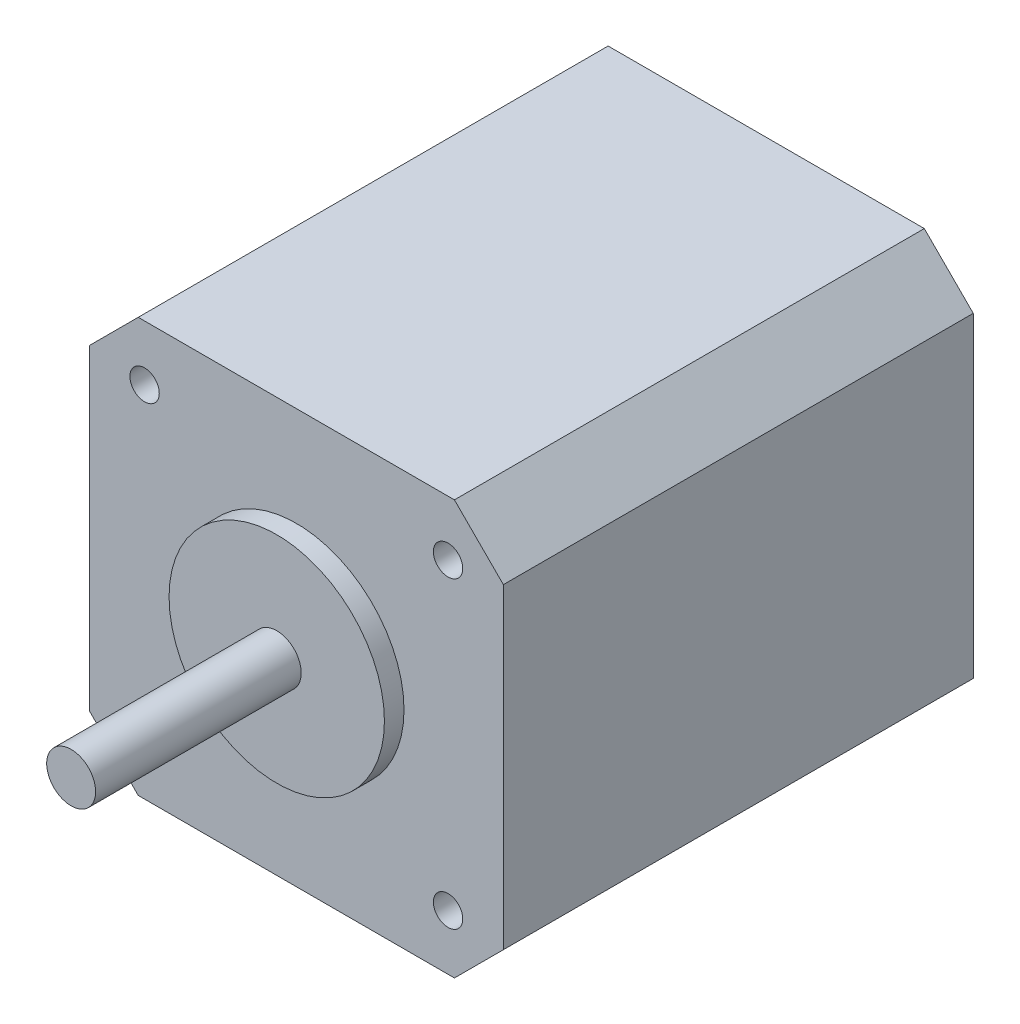
ISO-10303-21;
HEADER;
FILE_DESCRIPTION(('STEP AP214'),'2;1');
FILE_NAME('part.step','',(''),(''),'','','');
FILE_SCHEMA(('AUTOMOTIVE_DESIGN { 1 0 10303 214 1 1 1 1 }'));
ENDSEC;
DATA;
#1=APPLICATION_CONTEXT('core data for automotive mechanical design processes');
#2=APPLICATION_PROTOCOL_DEFINITION('international standard','automotive_design',2000,#1);
#3=PRODUCT_CONTEXT('',#1,'mechanical');
#4=PRODUCT('Part','Part','',(#3));
#5=PRODUCT_RELATED_PRODUCT_CATEGORY('part','',(#4));
#6=PRODUCT_DEFINITION_FORMATION('','',#4);
#7=PRODUCT_DEFINITION_CONTEXT('part definition',#1,'design');
#8=PRODUCT_DEFINITION('design','',#6,#7);
#9=PRODUCT_DEFINITION_SHAPE('','',#8);
#10=(LENGTH_UNIT() NAMED_UNIT(*) SI_UNIT(.MILLI.,.METRE.));
#11=(NAMED_UNIT(*) PLANE_ANGLE_UNIT() SI_UNIT($,.RADIAN.));
#12=(NAMED_UNIT(*) SI_UNIT($,.STERADIAN.) SOLID_ANGLE_UNIT());
#13=UNCERTAINTY_MEASURE_WITH_UNIT(LENGTH_MEASURE(1.E-05),#10,'distance_accuracy_value','');
#14=(GEOMETRIC_REPRESENTATION_CONTEXT(3) GLOBAL_UNCERTAINTY_ASSIGNED_CONTEXT((#13)) GLOBAL_UNIT_ASSIGNED_CONTEXT((#10,
#11,#12)) REPRESENTATION_CONTEXT('',''));
#15=CARTESIAN_POINT('',(0.,0.,0.));
#16=DIRECTION('',(0.,0.,1.));
#17=DIRECTION('',(1.,0.,0.));
#18=AXIS2_PLACEMENT_3D('',#15,#16,#17);
#19=CARTESIAN_POINT('',(21.15,21.15,-48.));
#20=DIRECTION('',(1.,0.,0.));
#21=DIRECTION('',(0.,0.,-1.));
#22=AXIS2_PLACEMENT_3D('',#19,#20,#21);
#23=PLANE('',#22);
#24=DIRECTION('',(0.,1.,0.));
#25=VECTOR('',#24,1.);
#26=CARTESIAN_POINT('',(21.15,21.15,0.));
#27=LINE('',#26,#25);
#28=CARTESIAN_POINT('',(21.15,-16.15,0.));
#29=VERTEX_POINT('',#28);
#30=CARTESIAN_POINT('',(21.15,16.15,0.));
#31=VERTEX_POINT('',#30);
#32=EDGE_CURVE('E210',#29,#31,#27,.T.);
#33=ORIENTED_EDGE('',*,*,#32,.F.);
#34=DIRECTION('',(0.,0.,-1.));
#35=VECTOR('',#34,1.);
#36=CARTESIAN_POINT('',(21.15,-16.15,-48.));
#37=LINE('',#36,#35);
#38=CARTESIAN_POINT('',(21.15,-16.15,-48.));
#39=VERTEX_POINT('',#38);
#40=EDGE_CURVE('E285',#29,#39,#37,.T.);
#41=ORIENTED_EDGE('',*,*,#40,.T.);
#42=DIRECTION('',(0.,1.,0.));
#43=VECTOR('',#42,1.);
#44=CARTESIAN_POINT('',(21.15,21.15,-48.));
#45=LINE('',#44,#43);
#46=CARTESIAN_POINT('',(21.15,16.15,-48.));
#47=VERTEX_POINT('',#46);
#48=EDGE_CURVE('E214',#39,#47,#45,.T.);
#49=ORIENTED_EDGE('',*,*,#48,.T.);
#50=DIRECTION('',(0.,0.,1.));
#51=VECTOR('',#50,1.);
#52=CARTESIAN_POINT('',(21.15,16.15,-48.));
#53=LINE('',#52,#51);
#54=EDGE_CURVE('E281',#47,#31,#53,.T.);
#55=ORIENTED_EDGE('',*,*,#54,.T.);
#56=EDGE_LOOP('',(#33,#41,#49,#55));
#57=FACE_BOUND('',#56,.T.);
#58=ADVANCED_FACE('F41',(#57),#23,.T.);
#59=CARTESIAN_POINT('',(-21.15,-21.15,-48.));
#60=DIRECTION('',(0.,-1.,0.));
#61=DIRECTION('',(0.,0.,-1.));
#62=AXIS2_PLACEMENT_3D('',#59,#60,#61);
#63=PLANE('',#62);
#64=DIRECTION('',(0.,0.,-1.));
#65=VECTOR('',#64,1.);
#66=CARTESIAN_POINT('',(-8.,-21.15,-38.4));
#67=LINE('',#66,#65);
#68=CARTESIAN_POINT('',(-8.,-21.15,-38.4));
#69=VERTEX_POINT('',#68);
#70=CARTESIAN_POINT('',(-8.,-21.15,-48.));
#71=VERTEX_POINT('',#70);
#72=EDGE_CURVE('E152',#69,#71,#67,.T.);
#73=ORIENTED_EDGE('',*,*,#72,.F.);
#74=DIRECTION('',(1.,0.,0.));
#75=VECTOR('',#74,1.);
#76=CARTESIAN_POINT('',(8.,-21.15,-38.4));
#77=LINE('',#76,#75);
#78=CARTESIAN_POINT('',(8.,-21.15,-38.4));
#79=VERTEX_POINT('',#78);
#80=EDGE_CURVE('E137',#69,#79,#77,.T.);
#81=ORIENTED_EDGE('',*,*,#80,.T.);
#82=DIRECTION('',(0.,0.,-1.));
#83=VECTOR('',#82,1.);
#84=CARTESIAN_POINT('',(8.,-21.15,-38.4));
#85=LINE('',#84,#83);
#86=CARTESIAN_POINT('',(7.99999999999999,-21.15,-48.));
#87=VERTEX_POINT('',#86);
#88=EDGE_CURVE('E163',#79,#87,#85,.T.);
#89=ORIENTED_EDGE('',*,*,#88,.T.);
#90=DIRECTION('',(1.,0.,0.));
#91=VECTOR('',#90,1.);
#92=CARTESIAN_POINT('',(-21.15,-21.15,-48.));
#93=LINE('',#92,#91);
#94=CARTESIAN_POINT('',(16.15,-21.15,-48.));
#95=VERTEX_POINT('',#94);
#96=EDGE_CURVE('E226',#87,#95,#93,.T.);
#97=ORIENTED_EDGE('',*,*,#96,.T.);
#98=DIRECTION('',(0.,0.,1.));
#99=VECTOR('',#98,1.);
#100=CARTESIAN_POINT('',(16.15,-21.15,-48.));
#101=LINE('',#100,#99);
#102=CARTESIAN_POINT('',(16.15,-21.15,0.));
#103=VERTEX_POINT('',#102);
#104=EDGE_CURVE('E262',#95,#103,#101,.T.);
#105=ORIENTED_EDGE('',*,*,#104,.T.);
#106=DIRECTION('',(1.,0.,0.));
#107=VECTOR('',#106,1.);
#108=CARTESIAN_POINT('',(-21.15,-21.15,0.));
#109=LINE('',#108,#107);
#110=CARTESIAN_POINT('',(-16.15,-21.15,0.));
#111=VERTEX_POINT('',#110);
#112=EDGE_CURVE('E219',#111,#103,#109,.T.);
#113=ORIENTED_EDGE('',*,*,#112,.F.);
#114=DIRECTION('',(0.,0.,-1.));
#115=VECTOR('',#114,1.);
#116=CARTESIAN_POINT('',(-16.15,-21.15,-48.));
#117=LINE('',#116,#115);
#118=CARTESIAN_POINT('',(-16.15,-21.15,-48.));
#119=VERTEX_POINT('',#118);
#120=EDGE_CURVE('E266',#111,#119,#117,.T.);
#121=ORIENTED_EDGE('',*,*,#120,.T.);
#122=EDGE_CURVE('E161',#119,#71,#93,.T.);
#123=ORIENTED_EDGE('',*,*,#122,.T.);
#124=EDGE_LOOP('',(#73,#81,#89,#97,#105,#113,#121,#123));
#125=FACE_BOUND('',#124,.T.);
#126=ADVANCED_FACE('F159',(#125),#63,.T.);
#127=CARTESIAN_POINT('',(-21.15,21.15,-48.));
#128=DIRECTION('',(-1.,0.,0.));
#129=DIRECTION('',(0.,-1.,0.));
#130=AXIS2_PLACEMENT_3D('',#127,#128,#129);
#131=PLANE('',#130);
#132=DIRECTION('',(0.,-1.,0.));
#133=VECTOR('',#132,1.);
#134=CARTESIAN_POINT('',(-21.15,21.15,-48.));
#135=LINE('',#134,#133);
#136=CARTESIAN_POINT('',(-21.15,16.15,-48.));
#137=VERTEX_POINT('',#136);
#138=CARTESIAN_POINT('',(-21.15,-16.15,-48.));
#139=VERTEX_POINT('',#138);
#140=EDGE_CURVE('E222',#137,#139,#135,.T.);
#141=ORIENTED_EDGE('',*,*,#140,.T.);
#142=DIRECTION('',(0.,0.,1.));
#143=VECTOR('',#142,1.);
#144=CARTESIAN_POINT('',(-21.15,-16.15,-48.));
#145=LINE('',#144,#143);
#146=CARTESIAN_POINT('',(-21.15,-16.15,0.));
#147=VERTEX_POINT('',#146);
#148=EDGE_CURVE('E246',#139,#147,#145,.T.);
#149=ORIENTED_EDGE('',*,*,#148,.T.);
#150=DIRECTION('',(0.,-1.,0.));
#151=VECTOR('',#150,1.);
#152=CARTESIAN_POINT('',(-21.15,21.15,0.));
#153=LINE('',#152,#151);
#154=CARTESIAN_POINT('',(-21.15,16.15,0.));
#155=VERTEX_POINT('',#154);
#156=EDGE_CURVE('E237',#155,#147,#153,.T.);
#157=ORIENTED_EDGE('',*,*,#156,.F.);
#158=DIRECTION('',(0.,0.,-1.));
#159=VECTOR('',#158,1.);
#160=CARTESIAN_POINT('',(-21.15,16.15,-48.));
#161=LINE('',#160,#159);
#162=EDGE_CURVE('E229',#155,#137,#161,.T.);
#163=ORIENTED_EDGE('',*,*,#162,.T.);
#164=EDGE_LOOP('',(#141,#149,#157,#163));
#165=FACE_BOUND('',#164,.T.);
#166=ADVANCED_FACE('F341',(#165),#131,.T.);
#167=CARTESIAN_POINT('',(-21.15,21.15,-48.));
#168=DIRECTION('',(0.,1.,0.));
#169=DIRECTION('',(0.,0.,1.));
#170=AXIS2_PLACEMENT_3D('',#167,#168,#169);
#171=PLANE('',#170);
#172=DIRECTION('',(-1.,0.,0.));
#173=VECTOR('',#172,1.);
#174=CARTESIAN_POINT('',(-21.15,21.15,0.));
#175=LINE('',#174,#173);
#176=CARTESIAN_POINT('',(16.15,21.15,0.));
#177=VERTEX_POINT('',#176);
#178=CARTESIAN_POINT('',(-16.15,21.15,0.));
#179=VERTEX_POINT('',#178);
#180=EDGE_CURVE('E233',#177,#179,#175,.T.);
#181=ORIENTED_EDGE('',*,*,#180,.F.);
#182=DIRECTION('',(0.,0.,-1.));
#183=VECTOR('',#182,1.);
#184=CARTESIAN_POINT('',(16.15,21.15,-48.));
#185=LINE('',#184,#183);
#186=CARTESIAN_POINT('',(16.15,21.15,-48.));
#187=VERTEX_POINT('',#186);
#188=EDGE_CURVE('E52',#177,#187,#185,.T.);
#189=ORIENTED_EDGE('',*,*,#188,.T.);
#190=DIRECTION('',(-1.,0.,0.));
#191=VECTOR('',#190,1.);
#192=CARTESIAN_POINT('',(-21.15,21.15,-48.));
#193=LINE('',#192,#191);
#194=CARTESIAN_POINT('',(-16.15,21.15,-48.));
#195=VERTEX_POINT('',#194);
#196=EDGE_CURVE('E218',#187,#195,#193,.T.);
#197=ORIENTED_EDGE('',*,*,#196,.T.);
#198=DIRECTION('',(0.,0.,1.));
#199=VECTOR('',#198,1.);
#200=CARTESIAN_POINT('',(-16.15,21.15,-48.));
#201=LINE('',#200,#199);
#202=EDGE_CURVE('E288',#195,#179,#201,.T.);
#203=ORIENTED_EDGE('',*,*,#202,.T.);
#204=EDGE_LOOP('',(#181,#189,#197,#203));
#205=FACE_BOUND('',#204,.T.);
#206=ADVANCED_FACE('F295',(#205),#171,.T.);
#207=CARTESIAN_POINT('',(0.,0.,-48.));
#208=DIRECTION('',(0.,0.,1.));
#209=DIRECTION('',(1.,0.,0.));
#210=AXIS2_PLACEMENT_3D('',#207,#208,#209);
#211=PLANE('',#210);
#212=ORIENTED_EDGE('',*,*,#122,.F.);
#213=DIRECTION('',(0.707106781186549,-0.707106781186546,0.));
#214=VECTOR('',#213,1.);
#215=CARTESIAN_POINT('',(-21.15,-16.15,-48.));
#216=LINE('',#215,#214);
#217=EDGE_CURVE('E278',#119,#139,#216,.F.);
#218=ORIENTED_EDGE('',*,*,#217,.T.);
#219=ORIENTED_EDGE('',*,*,#140,.F.);
#220=DIRECTION('',(-0.707106781186546,-0.707106781186549,0.));
#221=VECTOR('',#220,1.);
#222=CARTESIAN_POINT('',(-16.15,21.15,-48.));
#223=LINE('',#222,#221);
#224=EDGE_CURVE('E68',#137,#195,#223,.F.);
#225=ORIENTED_EDGE('',*,*,#224,.T.);
#226=ORIENTED_EDGE('',*,*,#196,.F.);
#227=DIRECTION('',(-0.707106781186549,0.707106781186546,0.));
#228=VECTOR('',#227,1.);
#229=CARTESIAN_POINT('',(21.15,16.15,-48.));
#230=LINE('',#229,#228);
#231=EDGE_CURVE('E271',#187,#47,#230,.F.);
#232=ORIENTED_EDGE('',*,*,#231,.T.);
#233=ORIENTED_EDGE('',*,*,#48,.F.);
#234=DIRECTION('',(0.707106781186546,0.707106781186549,0.));
#235=VECTOR('',#234,1.);
#236=CARTESIAN_POINT('',(16.15,-21.15,-48.));
#237=LINE('',#236,#235);
#238=EDGE_CURVE('E274',#39,#95,#237,.F.);
#239=ORIENTED_EDGE('',*,*,#238,.T.);
#240=ORIENTED_EDGE('',*,*,#96,.F.);
#241=DIRECTION('',(0.,-1.,0.));
#242=VECTOR('',#241,1.);
#243=CARTESIAN_POINT('',(8.,-28.15,-48.));
#244=LINE('',#243,#242);
#245=CARTESIAN_POINT('',(8.,-28.15,-48.));
#246=VERTEX_POINT('',#245);
#247=EDGE_CURVE('E60',#87,#246,#244,.T.);
#248=ORIENTED_EDGE('',*,*,#247,.T.);
#249=DIRECTION('',(-1.,0.,0.));
#250=VECTOR('',#249,1.);
#251=CARTESIAN_POINT('',(8.,-28.15,-48.));
#252=LINE('',#251,#250);
#253=CARTESIAN_POINT('',(-8.,-28.15,-48.));
#254=VERTEX_POINT('',#253);
#255=EDGE_CURVE('E156',#246,#254,#252,.T.);
#256=ORIENTED_EDGE('',*,*,#255,.T.);
#257=DIRECTION('',(0.,1.,0.));
#258=VECTOR('',#257,1.);
#259=CARTESIAN_POINT('',(-8.,-28.15,-48.));
#260=LINE('',#259,#258);
#261=EDGE_CURVE('E327',#254,#71,#260,.T.);
#262=ORIENTED_EDGE('',*,*,#261,.T.);
#263=EDGE_LOOP('',(#212,#218,#219,#225,#226,#232,#233,#239,#240,#248,#256,#262));
#264=FACE_BOUND('',#263,.T.);
#265=ADVANCED_FACE('F299',(#264),#211,.F.);
#266=CARTESIAN_POINT('',(0.,0.,0.));
#267=DIRECTION('',(0.,0.,1.));
#268=DIRECTION('',(1.,0.,0.));
#269=AXIS2_PLACEMENT_3D('',#266,#267,#268);
#270=PLANE('',#269);
#271=CARTESIAN_POINT('',(0.,0.,0.));
#272=DIRECTION('',(0.,0.,1.));
#273=DIRECTION('',(1.,0.,0.));
#274=AXIS2_PLACEMENT_3D('',#271,#272,#273);
#275=CIRCLE('',#274,11.);
#276=CARTESIAN_POINT('',(11.,0.,0.));
#277=VERTEX_POINT('',#276);
#278=EDGE_CURVE('E11',#277,#277,#275,.T.);
#279=ORIENTED_EDGE('',*,*,#278,.F.);
#280=EDGE_LOOP('',(#279));
#281=FACE_BOUND('',#280,.T.);
#282=CARTESIAN_POINT('',(15.5000000000002,15.4999999999998,0.));
#283=DIRECTION('',(0.,0.,1.));
#284=DIRECTION('',(1.,0.,0.));
#285=AXIS2_PLACEMENT_3D('',#282,#283,#284);
#286=CIRCLE('',#285,1.5);
#287=CARTESIAN_POINT('',(17.0000000000002,15.4999999999998,0.));
#288=VERTEX_POINT('',#287);
#289=EDGE_CURVE('E180',#288,#288,#286,.T.);
#290=ORIENTED_EDGE('',*,*,#289,.F.);
#291=EDGE_LOOP('',(#290));
#292=FACE_BOUND('',#291,.T.);
#293=CARTESIAN_POINT('',(-15.4999999999999,15.5000000000001,0.));
#294=DIRECTION('',(0.,0.,1.));
#295=DIRECTION('',(1.,0.,0.));
#296=AXIS2_PLACEMENT_3D('',#293,#294,#295);
#297=CIRCLE('',#296,1.5);
#298=CARTESIAN_POINT('',(-13.9999999999999,15.5000000000001,0.));
#299=VERTEX_POINT('',#298);
#300=EDGE_CURVE('E195',#299,#299,#297,.T.);
#301=ORIENTED_EDGE('',*,*,#300,.F.);
#302=EDGE_LOOP('',(#301));
#303=FACE_BOUND('',#302,.T.);
#304=CARTESIAN_POINT('',(-15.5000000000001,-15.4999999999999,0.));
#305=DIRECTION('',(0.,0.,1.));
#306=DIRECTION('',(1.,0.,0.));
#307=AXIS2_PLACEMENT_3D('',#304,#305,#306);
#308=CIRCLE('',#307,1.5);
#309=CARTESIAN_POINT('',(-14.0000000000001,-15.4999999999999,0.));
#310=VERTEX_POINT('',#309);
#311=EDGE_CURVE('E187',#310,#310,#308,.T.);
#312=ORIENTED_EDGE('',*,*,#311,.F.);
#313=EDGE_LOOP('',(#312));
#314=FACE_BOUND('',#313,.T.);
#315=CARTESIAN_POINT('',(15.5,-15.5,0.));
#316=DIRECTION('',(0.,0.,1.));
#317=DIRECTION('',(1.,0.,0.));
#318=AXIS2_PLACEMENT_3D('',#315,#316,#317);
#319=CIRCLE('',#318,1.5);
#320=CARTESIAN_POINT('',(17.,-15.5,0.));
#321=VERTEX_POINT('',#320);
#322=EDGE_CURVE('E186',#321,#321,#319,.T.);
#323=ORIENTED_EDGE('',*,*,#322,.F.);
#324=EDGE_LOOP('',(#323));
#325=FACE_BOUND('',#324,.T.);
#326=ORIENTED_EDGE('',*,*,#156,.T.);
#327=DIRECTION('',(-0.707106781186549,0.707106781186546,0.));
#328=VECTOR('',#327,1.);
#329=CARTESIAN_POINT('',(-18.6499999999999,-18.65,0.));
#330=LINE('',#329,#328);
#331=EDGE_CURVE('E259',#147,#111,#330,.F.);
#332=ORIENTED_EDGE('',*,*,#331,.T.);
#333=ORIENTED_EDGE('',*,*,#112,.T.);
#334=DIRECTION('',(-0.707106781186546,-0.707106781186549,0.));
#335=VECTOR('',#334,1.);
#336=CARTESIAN_POINT('',(18.65,-18.65,0.));
#337=LINE('',#336,#335);
#338=EDGE_CURVE('E256',#103,#29,#337,.F.);
#339=ORIENTED_EDGE('',*,*,#338,.T.);
#340=ORIENTED_EDGE('',*,*,#32,.T.);
#341=DIRECTION('',(0.707106781186549,-0.707106781186546,0.));
#342=VECTOR('',#341,1.);
#343=CARTESIAN_POINT('',(18.65,18.65,0.));
#344=LINE('',#343,#342);
#345=EDGE_CURVE('E253',#31,#177,#344,.F.);
#346=ORIENTED_EDGE('',*,*,#345,.T.);
#347=ORIENTED_EDGE('',*,*,#180,.T.);
#348=DIRECTION('',(0.707106781186546,0.707106781186549,0.));
#349=VECTOR('',#348,1.);
#350=CARTESIAN_POINT('',(-18.65,18.6499999999999,0.));
#351=LINE('',#350,#349);
#352=EDGE_CURVE('E250',#179,#155,#351,.F.);
#353=ORIENTED_EDGE('',*,*,#352,.T.);
#354=EDGE_LOOP('',(#326,#332,#333,#339,#340,#346,#347,#353));
#355=FACE_BOUND('',#354,.T.);
#356=ADVANCED_FACE('F307',(#281,#292,#303,#314,#325,#355),#270,.T.);
#357=CARTESIAN_POINT('',(-21.15,-16.15,-48.));
#358=DIRECTION('',(0.707106781186546,0.707106781186549,0.));
#359=DIRECTION('',(0.,0.,1.));
#360=AXIS2_PLACEMENT_3D('',#357,#358,#359);
#361=PLANE('',#360);
#362=ORIENTED_EDGE('',*,*,#217,.F.);
#363=ORIENTED_EDGE('',*,*,#120,.F.);
#364=ORIENTED_EDGE('',*,*,#331,.F.);
#365=ORIENTED_EDGE('',*,*,#148,.F.);
#366=EDGE_LOOP('',(#362,#363,#364,#365));
#367=FACE_BOUND('',#366,.T.);
#368=ADVANCED_FACE('F338',(#367),#361,.F.);
#369=CARTESIAN_POINT('',(16.15,-21.15,-48.));
#370=DIRECTION('',(-0.707106781186549,0.707106781186546,0.));
#371=DIRECTION('',(0.,0.,1.));
#372=AXIS2_PLACEMENT_3D('',#369,#370,#371);
#373=PLANE('',#372);
#374=ORIENTED_EDGE('',*,*,#238,.F.);
#375=ORIENTED_EDGE('',*,*,#40,.F.);
#376=ORIENTED_EDGE('',*,*,#338,.F.);
#377=ORIENTED_EDGE('',*,*,#104,.F.);
#378=EDGE_LOOP('',(#374,#375,#376,#377));
#379=FACE_BOUND('',#378,.T.);
#380=ADVANCED_FACE('F312',(#379),#373,.F.);
#381=CARTESIAN_POINT('',(21.15,16.15,-48.));
#382=DIRECTION('',(-0.707106781186546,-0.707106781186549,0.));
#383=DIRECTION('',(0.,0.,1.));
#384=AXIS2_PLACEMENT_3D('',#381,#382,#383);
#385=PLANE('',#384);
#386=ORIENTED_EDGE('',*,*,#231,.F.);
#387=ORIENTED_EDGE('',*,*,#188,.F.);
#388=ORIENTED_EDGE('',*,*,#345,.F.);
#389=ORIENTED_EDGE('',*,*,#54,.F.);
#390=EDGE_LOOP('',(#386,#387,#388,#389));
#391=FACE_BOUND('',#390,.T.);
#392=ADVANCED_FACE('F302',(#391),#385,.F.);
#393=CARTESIAN_POINT('',(-16.15,21.15,-48.));
#394=DIRECTION('',(0.707106781186549,-0.707106781186546,0.));
#395=DIRECTION('',(0.,0.,1.));
#396=AXIS2_PLACEMENT_3D('',#393,#394,#395);
#397=PLANE('',#396);
#398=ORIENTED_EDGE('',*,*,#224,.F.);
#399=ORIENTED_EDGE('',*,*,#162,.F.);
#400=ORIENTED_EDGE('',*,*,#352,.F.);
#401=ORIENTED_EDGE('',*,*,#202,.F.);
#402=EDGE_LOOP('',(#398,#399,#400,#401));
#403=FACE_BOUND('',#402,.T.);
#404=ADVANCED_FACE('F44',(#403),#397,.F.);
#405=CARTESIAN_POINT('',(15.5,-15.5,-5.));
#406=DIRECTION('',(0.,0.,1.));
#407=DIRECTION('',(1.,0.,0.));
#408=AXIS2_PLACEMENT_3D('',#405,#406,#407);
#409=CYLINDRICAL_SURFACE('',#408,1.5);
#410=CARTESIAN_POINT('',(15.5,-15.5,-5.));
#411=DIRECTION('',(0.,0.,1.));
#412=DIRECTION('',(1.,0.,0.));
#413=AXIS2_PLACEMENT_3D('',#410,#411,#412);
#414=CIRCLE('',#413,1.5);
#415=CARTESIAN_POINT('',(17.,-15.5,-5.));
#416=VERTEX_POINT('',#415);
#417=EDGE_CURVE('E206',#416,#416,#414,.T.);
#418=ORIENTED_EDGE('',*,*,#417,.F.);
#419=EDGE_LOOP('',(#418));
#420=FACE_BOUND('',#419,.T.);
#421=ORIENTED_EDGE('',*,*,#322,.T.);
#422=EDGE_LOOP('',(#421));
#423=FACE_BOUND('',#422,.T.);
#424=ADVANCED_FACE('F345',(#420,#423),#409,.F.);
#425=CARTESIAN_POINT('',(15.5,-15.5,-5.));
#426=DIRECTION('',(0.,0.,1.));
#427=DIRECTION('',(1.,0.,0.));
#428=AXIS2_PLACEMENT_3D('',#425,#426,#427);
#429=PLANE('',#428);
#430=ORIENTED_EDGE('',*,*,#417,.T.);
#431=EDGE_LOOP('',(#430));
#432=FACE_BOUND('',#431,.T.);
#433=ADVANCED_FACE('F350',(#432),#429,.T.);
#434=CARTESIAN_POINT('',(-15.5000000000001,-15.4999999999999,-5.));
#435=DIRECTION('',(0.,0.,1.));
#436=DIRECTION('',(1.,0.,0.));
#437=AXIS2_PLACEMENT_3D('',#434,#435,#436);
#438=CYLINDRICAL_SURFACE('',#437,1.5);
#439=CARTESIAN_POINT('',(-15.5000000000001,-15.4999999999999,-5.));
#440=DIRECTION('',(0.,0.,1.));
#441=DIRECTION('',(1.,0.,0.));
#442=AXIS2_PLACEMENT_3D('',#439,#440,#441);
#443=CIRCLE('',#442,1.5);
#444=CARTESIAN_POINT('',(-14.0000000000001,-15.4999999999999,-5.));
#445=VERTEX_POINT('',#444);
#446=EDGE_CURVE('E182',#445,#445,#443,.T.);
#447=ORIENTED_EDGE('',*,*,#446,.F.);
#448=EDGE_LOOP('',(#447));
#449=FACE_BOUND('',#448,.T.);
#450=ORIENTED_EDGE('',*,*,#311,.T.);
#451=EDGE_LOOP('',(#450));
#452=FACE_BOUND('',#451,.T.);
#453=ADVANCED_FACE('F404',(#449,#452),#438,.F.);
#454=CARTESIAN_POINT('',(-15.5000000000001,-15.4999999999999,-5.));
#455=DIRECTION('',(0.,0.,1.));
#456=DIRECTION('',(1.,0.,0.));
#457=AXIS2_PLACEMENT_3D('',#454,#455,#456);
#458=PLANE('',#457);
#459=ORIENTED_EDGE('',*,*,#446,.T.);
#460=EDGE_LOOP('',(#459));
#461=FACE_BOUND('',#460,.T.);
#462=ADVANCED_FACE('F414',(#461),#458,.T.);
#463=CARTESIAN_POINT('',(-15.4999999999999,15.5000000000001,-5.));
#464=DIRECTION('',(0.,0.,1.));
#465=DIRECTION('',(1.,0.,0.));
#466=AXIS2_PLACEMENT_3D('',#463,#464,#465);
#467=CYLINDRICAL_SURFACE('',#466,1.5);
#468=CARTESIAN_POINT('',(-15.4999999999999,15.5000000000001,-5.));
#469=DIRECTION('',(0.,0.,1.));
#470=DIRECTION('',(1.,0.,0.));
#471=AXIS2_PLACEMENT_3D('',#468,#469,#470);
#472=CIRCLE('',#471,1.5);
#473=CARTESIAN_POINT('',(-13.9999999999999,15.5000000000001,-5.));
#474=VERTEX_POINT('',#473);
#475=EDGE_CURVE('E191',#474,#474,#472,.T.);
#476=ORIENTED_EDGE('',*,*,#475,.F.);
#477=EDGE_LOOP('',(#476));
#478=FACE_BOUND('',#477,.T.);
#479=ORIENTED_EDGE('',*,*,#300,.T.);
#480=EDGE_LOOP('',(#479));
#481=FACE_BOUND('',#480,.T.);
#482=ADVANCED_FACE('F424',(#478,#481),#467,.F.);
#483=CARTESIAN_POINT('',(-15.4999999999999,15.5000000000001,-5.));
#484=DIRECTION('',(0.,0.,1.));
#485=DIRECTION('',(1.,0.,0.));
#486=AXIS2_PLACEMENT_3D('',#483,#484,#485);
#487=PLANE('',#486);
#488=ORIENTED_EDGE('',*,*,#475,.T.);
#489=EDGE_LOOP('',(#488));
#490=FACE_BOUND('',#489,.T.);
#491=ADVANCED_FACE('F434',(#490),#487,.T.);
#492=CARTESIAN_POINT('',(15.5000000000002,15.4999999999998,-5.));
#493=DIRECTION('',(0.,0.,1.));
#494=DIRECTION('',(1.,0.,0.));
#495=AXIS2_PLACEMENT_3D('',#492,#493,#494);
#496=CYLINDRICAL_SURFACE('',#495,1.5);
#497=CARTESIAN_POINT('',(15.5000000000002,15.4999999999998,-5.));
#498=DIRECTION('',(0.,0.,1.));
#499=DIRECTION('',(1.,0.,0.));
#500=AXIS2_PLACEMENT_3D('',#497,#498,#499);
#501=CIRCLE('',#500,1.5);
#502=CARTESIAN_POINT('',(17.0000000000002,15.4999999999998,-5.));
#503=VERTEX_POINT('',#502);
#504=EDGE_CURVE('E199',#503,#503,#501,.T.);
#505=ORIENTED_EDGE('',*,*,#504,.F.);
#506=EDGE_LOOP('',(#505));
#507=FACE_BOUND('',#506,.T.);
#508=ORIENTED_EDGE('',*,*,#289,.T.);
#509=EDGE_LOOP('',(#508));
#510=FACE_BOUND('',#509,.T.);
#511=ADVANCED_FACE('F444',(#507,#510),#496,.F.);
#512=CARTESIAN_POINT('',(15.5000000000002,15.4999999999998,-5.));
#513=DIRECTION('',(0.,0.,1.));
#514=DIRECTION('',(1.,0.,0.));
#515=AXIS2_PLACEMENT_3D('',#512,#513,#514);
#516=PLANE('',#515);
#517=ORIENTED_EDGE('',*,*,#504,.T.);
#518=EDGE_LOOP('',(#517));
#519=FACE_BOUND('',#518,.T.);
#520=ADVANCED_FACE('F454',(#519),#516,.T.);
#521=CARTESIAN_POINT('',(0.,0.,2.));
#522=DIRECTION('',(0.,0.,-1.));
#523=DIRECTION('',(-1.,0.,0.));
#524=AXIS2_PLACEMENT_3D('',#521,#522,#523);
#525=CYLINDRICAL_SURFACE('',#524,11.);
#526=CARTESIAN_POINT('',(0.,0.,2.));
#527=DIRECTION('',(0.,0.,1.));
#528=DIRECTION('',(1.,0.,0.));
#529=AXIS2_PLACEMENT_3D('',#526,#527,#528);
#530=CIRCLE('',#529,11.);
#531=CARTESIAN_POINT('',(11.,0.,2.));
#532=VERTEX_POINT('',#531);
#533=EDGE_CURVE('E177',#532,#532,#530,.T.);
#534=ORIENTED_EDGE('',*,*,#533,.F.);
#535=EDGE_LOOP('',(#534));
#536=FACE_BOUND('',#535,.T.);
#537=ORIENTED_EDGE('',*,*,#278,.T.);
#538=EDGE_LOOP('',(#537));
#539=FACE_BOUND('',#538,.T.);
#540=ADVANCED_FACE('F464',(#536,#539),#525,.T.);
#541=CARTESIAN_POINT('',(0.,0.,2.));
#542=DIRECTION('',(0.,0.,1.));
#543=DIRECTION('',(1.,0.,0.));
#544=AXIS2_PLACEMENT_3D('',#541,#542,#543);
#545=PLANE('',#544);
#546=CARTESIAN_POINT('',(0.,0.,2.));
#547=DIRECTION('',(0.,0.,1.));
#548=DIRECTION('',(1.,0.,0.));
#549=AXIS2_PLACEMENT_3D('',#546,#547,#548);
#550=CIRCLE('',#549,2.5);
#551=CARTESIAN_POINT('',(2.5,0.,2.));
#552=VERTEX_POINT('',#551);
#553=EDGE_CURVE('E46',#552,#552,#550,.F.);
#554=ORIENTED_EDGE('',*,*,#553,.T.);
#555=EDGE_LOOP('',(#554));
#556=FACE_BOUND('',#555,.T.);
#557=ORIENTED_EDGE('',*,*,#533,.T.);
#558=EDGE_LOOP('',(#557));
#559=FACE_BOUND('',#558,.T.);
#560=ADVANCED_FACE('F485',(#556,#559),#545,.T.);
#561=CARTESIAN_POINT('',(0.,0.,23.));
#562=DIRECTION('',(0.,0.,-1.));
#563=DIRECTION('',(-1.,0.,0.));
#564=AXIS2_PLACEMENT_3D('',#561,#562,#563);
#565=CYLINDRICAL_SURFACE('',#564,2.5);
#566=ORIENTED_EDGE('',*,*,#553,.F.);
#567=EDGE_LOOP('',(#566));
#568=FACE_BOUND('',#567,.T.);
#569=CARTESIAN_POINT('',(0.,0.,23.));
#570=DIRECTION('',(0.,0.,1.));
#571=DIRECTION('',(1.,0.,0.));
#572=AXIS2_PLACEMENT_3D('',#569,#570,#571);
#573=CIRCLE('',#572,2.5);
#574=CARTESIAN_POINT('',(2.5,0.,23.));
#575=VERTEX_POINT('',#574);
#576=EDGE_CURVE('E173',#575,#575,#573,.T.);
#577=ORIENTED_EDGE('',*,*,#576,.F.);
#578=EDGE_LOOP('',(#577));
#579=FACE_BOUND('',#578,.T.);
#580=ADVANCED_FACE('F495',(#568,#579),#565,.T.);
#581=CARTESIAN_POINT('',(0.,0.,23.));
#582=DIRECTION('',(0.,0.,1.));
#583=DIRECTION('',(1.,0.,0.));
#584=AXIS2_PLACEMENT_3D('',#581,#582,#583);
#585=PLANE('',#584);
#586=ORIENTED_EDGE('',*,*,#576,.T.);
#587=EDGE_LOOP('',(#586));
#588=FACE_BOUND('',#587,.T.);
#589=ADVANCED_FACE('F505',(#588),#585,.T.);
#590=CARTESIAN_POINT('',(-8.,-28.15,-38.4));
#591=DIRECTION('',(-1.,0.,0.));
#592=DIRECTION('',(0.,0.,1.));
#593=AXIS2_PLACEMENT_3D('',#590,#591,#592);
#594=PLANE('',#593);
#595=ORIENTED_EDGE('',*,*,#261,.F.);
#596=DIRECTION('',(0.,0.,-1.));
#597=VECTOR('',#596,1.);
#598=CARTESIAN_POINT('',(-8.,-28.15,-38.4));
#599=LINE('',#598,#597);
#600=CARTESIAN_POINT('',(-8.,-28.15,-38.4));
#601=VERTEX_POINT('',#600);
#602=EDGE_CURVE('E154',#601,#254,#599,.T.);
#603=ORIENTED_EDGE('',*,*,#602,.F.);
#604=DIRECTION('',(0.,1.,0.));
#605=VECTOR('',#604,1.);
#606=CARTESIAN_POINT('',(-8.,-28.15,-38.4));
#607=LINE('',#606,#605);
#608=EDGE_CURVE('E141',#601,#69,#607,.T.);
#609=ORIENTED_EDGE('',*,*,#608,.T.);
#610=ORIENTED_EDGE('',*,*,#72,.T.);
#611=EDGE_LOOP('',(#595,#603,#609,#610));
#612=FACE_BOUND('',#611,.T.);
#613=ADVANCED_FACE('F151',(#612),#594,.T.);
#614=CARTESIAN_POINT('',(8.,-28.15,-38.4));
#615=DIRECTION('',(0.,-1.,0.));
#616=DIRECTION('',(0.,0.,-1.));
#617=AXIS2_PLACEMENT_3D('',#614,#615,#616);
#618=PLANE('',#617);
#619=ORIENTED_EDGE('',*,*,#255,.F.);
#620=DIRECTION('',(0.,0.,-1.));
#621=VECTOR('',#620,1.);
#622=CARTESIAN_POINT('',(8.,-28.15,-38.4));
#623=LINE('',#622,#621);
#624=CARTESIAN_POINT('',(8.,-28.15,-38.4));
#625=VERTEX_POINT('',#624);
#626=EDGE_CURVE('E168',#625,#246,#623,.T.);
#627=ORIENTED_EDGE('',*,*,#626,.F.);
#628=DIRECTION('',(-1.,0.,0.));
#629=VECTOR('',#628,1.);
#630=CARTESIAN_POINT('',(8.,-28.15,-38.4));
#631=LINE('',#630,#629);
#632=EDGE_CURVE('E164',#625,#601,#631,.T.);
#633=ORIENTED_EDGE('',*,*,#632,.T.);
#634=ORIENTED_EDGE('',*,*,#602,.T.);
#635=EDGE_LOOP('',(#619,#627,#633,#634));
#636=FACE_BOUND('',#635,.T.);
#637=ADVANCED_FACE('F334',(#636),#618,.T.);
#638=CARTESIAN_POINT('',(8.,-28.15,-38.4));
#639=DIRECTION('',(1.,0.,0.));
#640=DIRECTION('',(0.,0.,-1.));
#641=AXIS2_PLACEMENT_3D('',#638,#639,#640);
#642=PLANE('',#641);
#643=ORIENTED_EDGE('',*,*,#247,.F.);
#644=ORIENTED_EDGE('',*,*,#88,.F.);
#645=DIRECTION('',(0.,-1.,0.));
#646=VECTOR('',#645,1.);
#647=CARTESIAN_POINT('',(8.,-28.15,-38.4));
#648=LINE('',#647,#646);
#649=EDGE_CURVE('E144',#79,#625,#648,.T.);
#650=ORIENTED_EDGE('',*,*,#649,.T.);
#651=ORIENTED_EDGE('',*,*,#626,.T.);
#652=EDGE_LOOP('',(#643,#644,#650,#651));
#653=FACE_BOUND('',#652,.T.);
#654=ADVANCED_FACE('F331',(#653),#642,.T.);
#655=CARTESIAN_POINT('',(0.,0.,-38.4));
#656=DIRECTION('',(0.,0.,1.));
#657=DIRECTION('',(1.,0.,0.));
#658=AXIS2_PLACEMENT_3D('',#655,#656,#657);
#659=PLANE('',#658);
#660=ORIENTED_EDGE('',*,*,#608,.F.);
#661=ORIENTED_EDGE('',*,*,#632,.F.);
#662=ORIENTED_EDGE('',*,*,#649,.F.);
#663=ORIENTED_EDGE('',*,*,#80,.F.);
#664=EDGE_LOOP('',(#660,#661,#662,#663));
#665=FACE_BOUND('',#664,.T.);
#666=ADVANCED_FACE('F139',(#665),#659,.T.);
#667=CLOSED_SHELL('',(#58,#126,#166,#206,#265,#356,#368,#380,#392,#404,#424,#433,#453,#462,#482,
#491,#511,#520,#540,#560,#580,#589,#613,#637,#654,#666));
#668=MANIFOLD_SOLID_BREP('B2',#667);
#669=ADVANCED_BREP_SHAPE_REPRESENTATION('',(#18,#668),#14);
#670=SHAPE_DEFINITION_REPRESENTATION(#9,#669);
ENDSEC;
END-ISO-10303-21;
